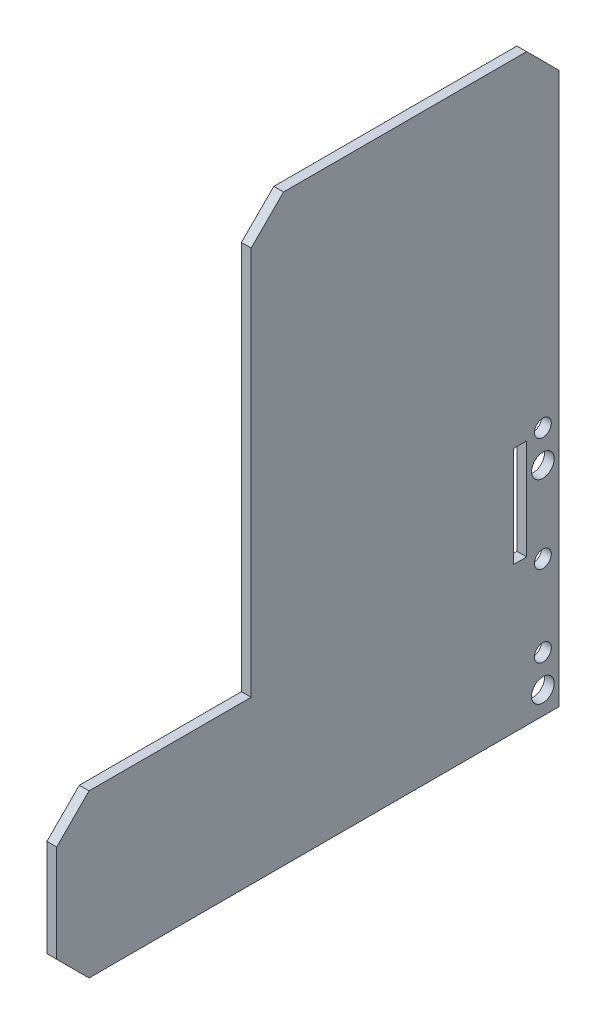
ISO-10303-21;
HEADER;
FILE_DESCRIPTION(('STEP AP214'),'2;1');
FILE_NAME('part.step','',(''),(''),'','','');
FILE_SCHEMA(('AUTOMOTIVE_DESIGN { 1 0 10303 214 1 1 1 1 }'));
ENDSEC;
DATA;
#1=APPLICATION_CONTEXT('core data for automotive mechanical design processes');
#2=APPLICATION_PROTOCOL_DEFINITION('international standard','automotive_design',2000,#1);
#3=PRODUCT_CONTEXT('',#1,'mechanical');
#4=PRODUCT('Part','Part','',(#3));
#5=PRODUCT_RELATED_PRODUCT_CATEGORY('part','',(#4));
#6=PRODUCT_DEFINITION_FORMATION('','',#4);
#7=PRODUCT_DEFINITION_CONTEXT('part definition',#1,'design');
#8=PRODUCT_DEFINITION('design','',#6,#7);
#9=PRODUCT_DEFINITION_SHAPE('','',#8);
#10=(LENGTH_UNIT() NAMED_UNIT(*) SI_UNIT(.MILLI.,.METRE.));
#11=(NAMED_UNIT(*) PLANE_ANGLE_UNIT() SI_UNIT($,.RADIAN.));
#12=(NAMED_UNIT(*) SI_UNIT($,.STERADIAN.) SOLID_ANGLE_UNIT());
#13=UNCERTAINTY_MEASURE_WITH_UNIT(LENGTH_MEASURE(1.E-05),#10,'distance_accuracy_value','');
#14=(GEOMETRIC_REPRESENTATION_CONTEXT(3) GLOBAL_UNCERTAINTY_ASSIGNED_CONTEXT((#13)) GLOBAL_UNIT_ASSIGNED_CONTEXT((#10,
#11,#12)) REPRESENTATION_CONTEXT('',''));
#15=CARTESIAN_POINT('',(0.,0.,0.));
#16=DIRECTION('',(0.,0.,1.));
#17=DIRECTION('',(1.,0.,0.));
#18=AXIS2_PLACEMENT_3D('',#15,#16,#17);
#19=CARTESIAN_POINT('',(1.5,-21.,-2.5));
#20=DIRECTION('',(-1.,0.,0.));
#21=DIRECTION('',(0.,0.,1.));
#22=AXIS2_PLACEMENT_3D('',#19,#20,#21);
#23=PLANE('',#22);
#24=DIRECTION('',(0.,0.,-1.));
#25=VECTOR('',#24,1.);
#26=CARTESIAN_POINT('',(1.5,17.,2.5));
#27=LINE('',#26,#25);
#28=CARTESIAN_POINT('',(1.5,17.,4.5));
#29=VERTEX_POINT('',#28);
#30=CARTESIAN_POINT('',(1.5,17.,2.5));
#31=VERTEX_POINT('',#30);
#32=EDGE_CURVE('E203',#29,#31,#27,.T.);
#33=ORIENTED_EDGE('',*,*,#32,.T.);
#34=DIRECTION('',(0.,-1.,0.));
#35=VECTOR('',#34,1.);
#36=CARTESIAN_POINT('',(1.5,17.,2.5));
#37=LINE('',#36,#35);
#38=CARTESIAN_POINT('',(1.5,1.5,2.5));
#39=VERTEX_POINT('',#38);
#40=EDGE_CURVE('E211',#31,#39,#37,.T.);
#41=ORIENTED_EDGE('',*,*,#40,.T.);
#42=DIRECTION('',(0.,0.,1.));
#43=VECTOR('',#42,1.);
#44=CARTESIAN_POINT('',(1.5,1.5,2.5));
#45=LINE('',#44,#43);
#46=CARTESIAN_POINT('',(1.5,1.5,4.5));
#47=VERTEX_POINT('',#46);
#48=EDGE_CURVE('E226',#39,#47,#45,.T.);
#49=ORIENTED_EDGE('',*,*,#48,.T.);
#50=DIRECTION('',(0.,1.,0.));
#51=VECTOR('',#50,1.);
#52=CARTESIAN_POINT('',(1.5,17.,4.5));
#53=LINE('',#52,#51);
#54=EDGE_CURVE('E223',#47,#29,#53,.T.);
#55=ORIENTED_EDGE('',*,*,#54,.T.);
#56=EDGE_LOOP('',(#33,#41,#49,#55));
#57=FACE_BOUND('',#56,.T.);
#58=CARTESIAN_POINT('',(1.5,17.5000000000024,0.));
#59=DIRECTION('',(1.,0.,0.));
#60=DIRECTION('',(0.,0.,-1.));
#61=AXIS2_PLACEMENT_3D('',#58,#59,#60);
#62=CIRCLE('',#61,1.29999994);
#63=CARTESIAN_POINT('',(1.5,17.5000000000024,-1.29999994));
#64=VERTEX_POINT('',#63);
#65=EDGE_CURVE('E195',#64,#64,#62,.T.);
#66=ORIENTED_EDGE('',*,*,#65,.F.);
#67=EDGE_LOOP('',(#66));
#68=FACE_BOUND('',#67,.T.);
#69=CARTESIAN_POINT('',(1.5,-12.4999999999975,0.));
#70=DIRECTION('',(1.,0.,0.));
#71=DIRECTION('',(0.,0.,-1.));
#72=AXIS2_PLACEMENT_3D('',#69,#70,#71);
#73=CIRCLE('',#72,1.29999994);
#74=CARTESIAN_POINT('',(1.5,-12.4999999999975,-1.29999994));
#75=VERTEX_POINT('',#74);
#76=EDGE_CURVE('E189',#75,#75,#73,.T.);
#77=ORIENTED_EDGE('',*,*,#76,.F.);
#78=EDGE_LOOP('',(#77));
#79=FACE_BOUND('',#78,.T.);
#80=CARTESIAN_POINT('',(1.5,0.,0.));
#81=DIRECTION('',(1.,0.,0.));
#82=DIRECTION('',(0.,0.,-1.));
#83=AXIS2_PLACEMENT_3D('',#80,#81,#82);
#84=CIRCLE('',#83,1.29999994);
#85=CARTESIAN_POINT('',(1.5,0.,-1.29999994));
#86=VERTEX_POINT('',#85);
#87=EDGE_CURVE('E183',#86,#86,#84,.T.);
#88=ORIENTED_EDGE('',*,*,#87,.F.);
#89=EDGE_LOOP('',(#88));
#90=FACE_BOUND('',#89,.T.);
#91=CARTESIAN_POINT('',(1.5,-17.4999999999984,1.66533453693773E-13));
#92=DIRECTION('',(1.,0.,0.));
#93=DIRECTION('',(0.,0.,-1.));
#94=AXIS2_PLACEMENT_3D('',#91,#92,#93);
#95=CIRCLE('',#94,1.75);
#96=CARTESIAN_POINT('',(1.5,-17.4999999999984,-1.74999999999984));
#97=VERTEX_POINT('',#96);
#98=EDGE_CURVE('E161',#97,#97,#95,.T.);
#99=ORIENTED_EDGE('',*,*,#98,.F.);
#100=EDGE_LOOP('',(#99));
#101=FACE_BOUND('',#100,.T.);
#102=DIRECTION('',(0.,-1.,0.));
#103=VECTOR('',#102,1.);
#104=CARTESIAN_POINT('',(1.5,69.,75.));
#105=LINE('',#104,#103);
#106=CARTESIAN_POINT('',(1.5,-1.00000000000001,75.));
#107=VERTEX_POINT('',#106);
#108=CARTESIAN_POINT('',(1.5,-16.,75.));
#109=VERTEX_POINT('',#108);
#110=EDGE_CURVE('E163',#107,#109,#105,.T.);
#111=ORIENTED_EDGE('',*,*,#110,.T.);
#112=DIRECTION('',(0.,0.707106781186545,0.70710678118655));
#113=VECTOR('',#112,1.);
#114=CARTESIAN_POINT('',(1.5,-21.,70.));
#115=LINE('',#114,#113);
#116=CARTESIAN_POINT('',(1.5,-21.,70.));
#117=VERTEX_POINT('',#116);
#118=EDGE_CURVE('E132',#117,#109,#115,.T.);
#119=ORIENTED_EDGE('',*,*,#118,.F.);
#120=DIRECTION('',(0.,0.,-1.));
#121=VECTOR('',#120,1.);
#122=CARTESIAN_POINT('',(1.5,-21.,-2.5));
#123=LINE('',#122,#121);
#124=CARTESIAN_POINT('',(1.5,-21.,-2.5));
#125=VERTEX_POINT('',#124);
#126=EDGE_CURVE('E38',#117,#125,#123,.T.);
#127=ORIENTED_EDGE('',*,*,#126,.T.);
#128=DIRECTION('',(0.,1.,0.));
#129=VECTOR('',#128,1.);
#130=CARTESIAN_POINT('',(1.5,69.,-2.49999999999999));
#131=LINE('',#130,#129);
#132=CARTESIAN_POINT('',(1.5,64.,-2.49999999999999));
#133=VERTEX_POINT('',#132);
#134=EDGE_CURVE('E155',#125,#133,#131,.T.);
#135=ORIENTED_EDGE('',*,*,#134,.T.);
#136=DIRECTION('',(0.,-0.707106781186548,-0.707106781186547));
#137=VECTOR('',#136,1.);
#138=CARTESIAN_POINT('',(1.5,64.,-2.49999999999999));
#139=LINE('',#138,#137);
#140=CARTESIAN_POINT('',(1.5,69.,2.50000000000001));
#141=VERTEX_POINT('',#140);
#142=EDGE_CURVE('E137',#141,#133,#139,.T.);
#143=ORIENTED_EDGE('',*,*,#142,.F.);
#144=DIRECTION('',(0.,0.,1.));
#145=VECTOR('',#144,1.);
#146=CARTESIAN_POINT('',(1.5,69.,-2.49999999999999));
#147=LINE('',#146,#145);
#148=CARTESIAN_POINT('',(1.5,69.,40.));
#149=VERTEX_POINT('',#148);
#150=EDGE_CURVE('E165',#141,#149,#147,.T.);
#151=ORIENTED_EDGE('',*,*,#150,.T.);
#152=DIRECTION('',(0.,0.707106781186544,-0.707106781186551));
#153=VECTOR('',#152,1.);
#154=CARTESIAN_POINT('',(1.5,64.,45.));
#155=LINE('',#154,#153);
#156=CARTESIAN_POINT('',(1.5,64.,45.));
#157=VERTEX_POINT('',#156);
#158=EDGE_CURVE('E233',#157,#149,#155,.T.);
#159=ORIENTED_EDGE('',*,*,#158,.F.);
#160=DIRECTION('',(0.,1.,0.));
#161=VECTOR('',#160,1.);
#162=CARTESIAN_POINT('',(1.5,3.99999999999999,45.));
#163=LINE('',#162,#161);
#164=CARTESIAN_POINT('',(1.5,3.99999999999999,45.));
#165=VERTEX_POINT('',#164);
#166=EDGE_CURVE('E243',#165,#157,#163,.T.);
#167=ORIENTED_EDGE('',*,*,#166,.F.);
#168=DIRECTION('',(0.,0.,-1.));
#169=VECTOR('',#168,1.);
#170=CARTESIAN_POINT('',(1.5,3.99999999999999,70.));
#171=LINE('',#170,#169);
#172=CARTESIAN_POINT('',(1.5,3.99999999999999,70.));
#173=VERTEX_POINT('',#172);
#174=EDGE_CURVE('E246',#173,#165,#171,.T.);
#175=ORIENTED_EDGE('',*,*,#174,.F.);
#176=DIRECTION('',(0.,0.707106781186547,-0.707106781186548));
#177=VECTOR('',#176,1.);
#178=CARTESIAN_POINT('',(1.5,3.99999999999999,70.));
#179=LINE('',#178,#177);
#180=EDGE_CURVE('E249',#107,#173,#179,.T.);
#181=ORIENTED_EDGE('',*,*,#180,.F.);
#182=EDGE_LOOP('',(#111,#119,#127,#135,#143,#151,#159,#167,#175,#181));
#183=FACE_BOUND('',#182,.T.);
#184=CARTESIAN_POINT('',(1.5,12.5000000000017,0.));
#185=DIRECTION('',(1.,0.,0.));
#186=DIRECTION('',(0.,0.,-1.));
#187=AXIS2_PLACEMENT_3D('',#184,#185,#186);
#188=CIRCLE('',#187,1.75);
#189=CARTESIAN_POINT('',(1.5,12.5000000000017,-1.75000000000006));
#190=VERTEX_POINT('',#189);
#191=EDGE_CURVE('E172',#190,#190,#188,.T.);
#192=ORIENTED_EDGE('',*,*,#191,.F.);
#193=EDGE_LOOP('',(#192));
#194=FACE_BOUND('',#193,.T.);
#195=ADVANCED_FACE('F30',(#57,#68,#79,#90,#101,#183,#194),#23,.F.);
#196=CARTESIAN_POINT('',(0.,-21.,-2.5));
#197=DIRECTION('',(-1.,0.,0.));
#198=DIRECTION('',(0.,0.,1.));
#199=AXIS2_PLACEMENT_3D('',#196,#197,#198);
#200=PLANE('',#199);
#201=DIRECTION('',(0.,0.707106781186545,0.70710678118655));
#202=VECTOR('',#201,1.);
#203=CARTESIAN_POINT('',(0.,-21.,70.));
#204=LINE('',#203,#202);
#205=CARTESIAN_POINT('',(0.,-21.,70.));
#206=VERTEX_POINT('',#205);
#207=CARTESIAN_POINT('',(0.,-16.,75.));
#208=VERTEX_POINT('',#207);
#209=EDGE_CURVE('E45',#206,#208,#204,.T.);
#210=ORIENTED_EDGE('',*,*,#209,.T.);
#211=DIRECTION('',(0.,-1.,0.));
#212=VECTOR('',#211,1.);
#213=CARTESIAN_POINT('',(0.,69.,75.));
#214=LINE('',#213,#212);
#215=CARTESIAN_POINT('',(0.,-0.999999999999959,75.));
#216=VERTEX_POINT('',#215);
#217=EDGE_CURVE('E146',#216,#208,#214,.T.);
#218=ORIENTED_EDGE('',*,*,#217,.F.);
#219=DIRECTION('',(0.,0.707106781186547,-0.707106781186548));
#220=VECTOR('',#219,1.);
#221=CARTESIAN_POINT('',(0.,3.99999999999999,70.));
#222=LINE('',#221,#220);
#223=CARTESIAN_POINT('',(0.,3.99999999999999,70.));
#224=VERTEX_POINT('',#223);
#225=EDGE_CURVE('E261',#216,#224,#222,.T.);
#226=ORIENTED_EDGE('',*,*,#225,.T.);
#227=DIRECTION('',(0.,0.,-1.));
#228=VECTOR('',#227,1.);
#229=CARTESIAN_POINT('',(0.,3.99999999999999,70.));
#230=LINE('',#229,#228);
#231=CARTESIAN_POINT('',(0.,3.99999999999999,45.));
#232=VERTEX_POINT('',#231);
#233=EDGE_CURVE('E258',#224,#232,#230,.T.);
#234=ORIENTED_EDGE('',*,*,#233,.T.);
#235=DIRECTION('',(0.,1.,0.));
#236=VECTOR('',#235,1.);
#237=CARTESIAN_POINT('',(0.,3.99999999999999,45.));
#238=LINE('',#237,#236);
#239=CARTESIAN_POINT('',(0.,64.,45.));
#240=VERTEX_POINT('',#239);
#241=EDGE_CURVE('E255',#232,#240,#238,.T.);
#242=ORIENTED_EDGE('',*,*,#241,.T.);
#243=DIRECTION('',(0.,0.707106781186544,-0.707106781186551));
#244=VECTOR('',#243,1.);
#245=CARTESIAN_POINT('',(0.,64.,45.));
#246=LINE('',#245,#244);
#247=CARTESIAN_POINT('',(0.,69.,40.));
#248=VERTEX_POINT('',#247);
#249=EDGE_CURVE('E252',#240,#248,#246,.T.);
#250=ORIENTED_EDGE('',*,*,#249,.T.);
#251=DIRECTION('',(0.,0.,1.));
#252=VECTOR('',#251,1.);
#253=CARTESIAN_POINT('',(0.,69.,-2.49999999999999));
#254=LINE('',#253,#252);
#255=CARTESIAN_POINT('',(0.,69.,2.50000000000001));
#256=VERTEX_POINT('',#255);
#257=EDGE_CURVE('E153',#256,#248,#254,.T.);
#258=ORIENTED_EDGE('',*,*,#257,.F.);
#259=DIRECTION('',(0.,-0.707106781186548,-0.707106781186547));
#260=VECTOR('',#259,1.);
#261=CARTESIAN_POINT('',(0.,64.,-2.49999999999999));
#262=LINE('',#261,#260);
#263=CARTESIAN_POINT('',(0.,64.,-2.49999999999999));
#264=VERTEX_POINT('',#263);
#265=EDGE_CURVE('E53',#256,#264,#262,.T.);
#266=ORIENTED_EDGE('',*,*,#265,.T.);
#267=DIRECTION('',(0.,1.,0.));
#268=VECTOR('',#267,1.);
#269=CARTESIAN_POINT('',(0.,69.,-2.49999999999999));
#270=LINE('',#269,#268);
#271=CARTESIAN_POINT('',(0.,-21.,-2.5));
#272=VERTEX_POINT('',#271);
#273=EDGE_CURVE('E156',#272,#264,#270,.T.);
#274=ORIENTED_EDGE('',*,*,#273,.F.);
#275=DIRECTION('',(0.,0.,-1.));
#276=VECTOR('',#275,1.);
#277=CARTESIAN_POINT('',(0.,-21.,-2.5));
#278=LINE('',#277,#276);
#279=EDGE_CURVE('E148',#206,#272,#278,.T.);
#280=ORIENTED_EDGE('',*,*,#279,.F.);
#281=EDGE_LOOP('',(#210,#218,#226,#234,#242,#250,#258,#266,#274,#280));
#282=FACE_BOUND('',#281,.T.);
#283=DIRECTION('',(0.,-1.,0.));
#284=VECTOR('',#283,1.);
#285=CARTESIAN_POINT('',(0.,17.,2.5));
#286=LINE('',#285,#284);
#287=CARTESIAN_POINT('',(0.,17.,2.5));
#288=VERTEX_POINT('',#287);
#289=CARTESIAN_POINT('',(0.,1.5,2.5));
#290=VERTEX_POINT('',#289);
#291=EDGE_CURVE('E218',#288,#290,#286,.T.);
#292=ORIENTED_EDGE('',*,*,#291,.F.);
#293=DIRECTION('',(0.,0.,-1.));
#294=VECTOR('',#293,1.);
#295=CARTESIAN_POINT('',(0.,17.,2.5));
#296=LINE('',#295,#294);
#297=CARTESIAN_POINT('',(0.,17.,4.5));
#298=VERTEX_POINT('',#297);
#299=EDGE_CURVE('E208',#298,#288,#296,.T.);
#300=ORIENTED_EDGE('',*,*,#299,.F.);
#301=DIRECTION('',(0.,1.,0.));
#302=VECTOR('',#301,1.);
#303=CARTESIAN_POINT('',(0.,17.,4.5));
#304=LINE('',#303,#302);
#305=CARTESIAN_POINT('',(0.,1.5,4.5));
#306=VERTEX_POINT('',#305);
#307=EDGE_CURVE('E212',#306,#298,#304,.T.);
#308=ORIENTED_EDGE('',*,*,#307,.F.);
#309=DIRECTION('',(0.,0.,1.));
#310=VECTOR('',#309,1.);
#311=CARTESIAN_POINT('',(0.,1.5,2.5));
#312=LINE('',#311,#310);
#313=EDGE_CURVE('E215',#290,#306,#312,.T.);
#314=ORIENTED_EDGE('',*,*,#313,.F.);
#315=EDGE_LOOP('',(#292,#300,#308,#314));
#316=FACE_BOUND('',#315,.T.);
#317=CARTESIAN_POINT('',(0.,17.5000000000024,0.));
#318=DIRECTION('',(1.,0.,0.));
#319=DIRECTION('',(0.,0.,-1.));
#320=AXIS2_PLACEMENT_3D('',#317,#318,#319);
#321=CIRCLE('',#320,1.29999994);
#322=CARTESIAN_POINT('',(0.,17.5000000000024,-1.29999994));
#323=VERTEX_POINT('',#322);
#324=EDGE_CURVE('E192',#323,#323,#321,.T.);
#325=ORIENTED_EDGE('',*,*,#324,.T.);
#326=EDGE_LOOP('',(#325));
#327=FACE_BOUND('',#326,.T.);
#328=CARTESIAN_POINT('',(0.,-12.4999999999975,0.));
#329=DIRECTION('',(1.,0.,0.));
#330=DIRECTION('',(0.,0.,-1.));
#331=AXIS2_PLACEMENT_3D('',#328,#329,#330);
#332=CIRCLE('',#331,1.29999994);
#333=CARTESIAN_POINT('',(0.,-12.4999999999975,-1.29999994));
#334=VERTEX_POINT('',#333);
#335=EDGE_CURVE('E186',#334,#334,#332,.T.);
#336=ORIENTED_EDGE('',*,*,#335,.T.);
#337=EDGE_LOOP('',(#336));
#338=FACE_BOUND('',#337,.T.);
#339=CARTESIAN_POINT('',(0.,0.,0.));
#340=DIRECTION('',(1.,0.,0.));
#341=DIRECTION('',(0.,0.,-1.));
#342=AXIS2_PLACEMENT_3D('',#339,#340,#341);
#343=CIRCLE('',#342,1.29999994);
#344=CARTESIAN_POINT('',(0.,0.,-1.29999994));
#345=VERTEX_POINT('',#344);
#346=EDGE_CURVE('E178',#345,#345,#343,.T.);
#347=ORIENTED_EDGE('',*,*,#346,.T.);
#348=EDGE_LOOP('',(#347));
#349=FACE_BOUND('',#348,.T.);
#350=CARTESIAN_POINT('',(0.,-17.4999999999984,1.66533453693773E-13));
#351=DIRECTION('',(1.,0.,0.));
#352=DIRECTION('',(0.,0.,-1.));
#353=AXIS2_PLACEMENT_3D('',#350,#351,#352);
#354=CIRCLE('',#353,1.75);
#355=CARTESIAN_POINT('',(0.,-17.4999999999984,-1.74999999999984));
#356=VERTEX_POINT('',#355);
#357=EDGE_CURVE('E169',#356,#356,#354,.T.);
#358=ORIENTED_EDGE('',*,*,#357,.T.);
#359=EDGE_LOOP('',(#358));
#360=FACE_BOUND('',#359,.T.);
#361=CARTESIAN_POINT('',(0.,12.5000000000017,0.));
#362=DIRECTION('',(1.,0.,0.));
#363=DIRECTION('',(0.,0.,-1.));
#364=AXIS2_PLACEMENT_3D('',#361,#362,#363);
#365=CIRCLE('',#364,1.75);
#366=CARTESIAN_POINT('',(0.,12.5000000000017,-1.75000000000006));
#367=VERTEX_POINT('',#366);
#368=EDGE_CURVE('E175',#367,#367,#365,.T.);
#369=ORIENTED_EDGE('',*,*,#368,.T.);
#370=EDGE_LOOP('',(#369));
#371=FACE_BOUND('',#370,.T.);
#372=ADVANCED_FACE('F143',(#282,#316,#327,#338,#349,#360,#371),#200,.T.);
#373=CARTESIAN_POINT('',(1.5,69.,-2.49999999999999));
#374=DIRECTION('',(0.,0.,1.));
#375=DIRECTION('',(0.,-1.,0.));
#376=AXIS2_PLACEMENT_3D('',#373,#374,#375);
#377=PLANE('',#376);
#378=ORIENTED_EDGE('',*,*,#273,.T.);
#379=DIRECTION('',(1.,0.,0.));
#380=VECTOR('',#379,1.);
#381=CARTESIAN_POINT('',(-0.000999999999999916,64.,-2.49999999999999));
#382=LINE('',#381,#380);
#383=EDGE_CURVE('E264',#264,#133,#382,.T.);
#384=ORIENTED_EDGE('',*,*,#383,.T.);
#385=ORIENTED_EDGE('',*,*,#134,.F.);
#386=DIRECTION('',(-1.,0.,0.));
#387=VECTOR('',#386,1.);
#388=CARTESIAN_POINT('',(1.5,-21.,-2.5));
#389=LINE('',#388,#387);
#390=EDGE_CURVE('E11',#125,#272,#389,.T.);
#391=ORIENTED_EDGE('',*,*,#390,.T.);
#392=EDGE_LOOP('',(#378,#384,#385,#391));
#393=FACE_BOUND('',#392,.T.);
#394=ADVANCED_FACE('F32',(#393),#377,.F.);
#395=CARTESIAN_POINT('',(1.5,69.,-2.49999999999999));
#396=DIRECTION('',(0.,-1.,0.));
#397=DIRECTION('',(0.,0.,-1.));
#398=AXIS2_PLACEMENT_3D('',#395,#396,#397);
#399=PLANE('',#398);
#400=ORIENTED_EDGE('',*,*,#150,.F.);
#401=DIRECTION('',(1.,0.,0.));
#402=VECTOR('',#401,1.);
#403=CARTESIAN_POINT('',(-0.000999999999999916,69.,2.50000000000001));
#404=LINE('',#403,#402);
#405=EDGE_CURVE('E265',#256,#141,#404,.T.);
#406=ORIENTED_EDGE('',*,*,#405,.F.);
#407=ORIENTED_EDGE('',*,*,#257,.T.);
#408=DIRECTION('',(1.,0.,0.));
#409=VECTOR('',#408,1.);
#410=CARTESIAN_POINT('',(-0.000999999999999916,69.,40.));
#411=LINE('',#410,#409);
#412=EDGE_CURVE('E220',#248,#149,#411,.T.);
#413=ORIENTED_EDGE('',*,*,#412,.T.);
#414=EDGE_LOOP('',(#400,#406,#407,#413));
#415=FACE_BOUND('',#414,.T.);
#416=ADVANCED_FACE('F284',(#415),#399,.F.);
#417=CARTESIAN_POINT('',(1.5,69.,75.));
#418=DIRECTION('',(0.,0.,-1.));
#419=DIRECTION('',(-1.,0.,0.));
#420=AXIS2_PLACEMENT_3D('',#417,#418,#419);
#421=PLANE('',#420);
#422=ORIENTED_EDGE('',*,*,#217,.T.);
#423=DIRECTION('',(1.,0.,0.));
#424=VECTOR('',#423,1.);
#425=CARTESIAN_POINT('',(-0.000999999999999916,-16.,75.));
#426=LINE('',#425,#424);
#427=EDGE_CURVE('E129',#208,#109,#426,.T.);
#428=ORIENTED_EDGE('',*,*,#427,.T.);
#429=ORIENTED_EDGE('',*,*,#110,.F.);
#430=DIRECTION('',(1.,0.,0.));
#431=VECTOR('',#430,1.);
#432=CARTESIAN_POINT('',(-0.000999999999999916,-1.00000000000001,75.));
#433=LINE('',#432,#431);
#434=EDGE_CURVE('E152',#216,#107,#433,.T.);
#435=ORIENTED_EDGE('',*,*,#434,.F.);
#436=EDGE_LOOP('',(#422,#428,#429,#435));
#437=FACE_BOUND('',#436,.T.);
#438=ADVANCED_FACE('F151',(#437),#421,.F.);
#439=CARTESIAN_POINT('',(1.5,-21.,-2.5));
#440=DIRECTION('',(0.,1.,0.));
#441=DIRECTION('',(0.,0.,1.));
#442=AXIS2_PLACEMENT_3D('',#439,#440,#441);
#443=PLANE('',#442);
#444=ORIENTED_EDGE('',*,*,#126,.F.);
#445=DIRECTION('',(1.,0.,0.));
#446=VECTOR('',#445,1.);
#447=CARTESIAN_POINT('',(-0.000999999999999916,-21.,70.));
#448=LINE('',#447,#446);
#449=EDGE_CURVE('E138',#206,#117,#448,.T.);
#450=ORIENTED_EDGE('',*,*,#449,.F.);
#451=ORIENTED_EDGE('',*,*,#279,.T.);
#452=ORIENTED_EDGE('',*,*,#390,.F.);
#453=EDGE_LOOP('',(#444,#450,#451,#452));
#454=FACE_BOUND('',#453,.T.);
#455=ADVANCED_FACE('F277',(#454),#443,.F.);
#456=CARTESIAN_POINT('',(1.5,-17.4999999999984,1.66533453693773E-13));
#457=DIRECTION('',(-1.,0.,0.));
#458=DIRECTION('',(0.,0.,1.));
#459=AXIS2_PLACEMENT_3D('',#456,#457,#458);
#460=CYLINDRICAL_SURFACE('',#459,1.75);
#461=ORIENTED_EDGE('',*,*,#98,.T.);
#462=EDGE_LOOP('',(#461));
#463=FACE_BOUND('',#462,.T.);
#464=ORIENTED_EDGE('',*,*,#357,.F.);
#465=EDGE_LOOP('',(#464));
#466=FACE_BOUND('',#465,.T.);
#467=ADVANCED_FACE('F319',(#463,#466),#460,.F.);
#468=CARTESIAN_POINT('',(1.5,12.5000000000017,0.));
#469=DIRECTION('',(-1.,0.,0.));
#470=DIRECTION('',(0.,0.,1.));
#471=AXIS2_PLACEMENT_3D('',#468,#469,#470);
#472=CYLINDRICAL_SURFACE('',#471,1.75);
#473=ORIENTED_EDGE('',*,*,#191,.T.);
#474=EDGE_LOOP('',(#473));
#475=FACE_BOUND('',#474,.T.);
#476=ORIENTED_EDGE('',*,*,#368,.F.);
#477=EDGE_LOOP('',(#476));
#478=FACE_BOUND('',#477,.T.);
#479=ADVANCED_FACE('F410',(#475,#478),#472,.F.);
#480=CARTESIAN_POINT('',(1.5,0.,0.));
#481=DIRECTION('',(1.,0.,0.));
#482=DIRECTION('',(0.,0.,-1.));
#483=AXIS2_PLACEMENT_3D('',#480,#481,#482);
#484=CYLINDRICAL_SURFACE('',#483,1.29999994);
#485=ORIENTED_EDGE('',*,*,#346,.F.);
#486=EDGE_LOOP('',(#485));
#487=FACE_BOUND('',#486,.T.);
#488=ORIENTED_EDGE('',*,*,#87,.T.);
#489=EDGE_LOOP('',(#488));
#490=FACE_BOUND('',#489,.T.);
#491=ADVANCED_FACE('F400',(#487,#490),#484,.F.);
#492=CARTESIAN_POINT('',(1.5,-12.4999999999975,0.));
#493=DIRECTION('',(1.,0.,0.));
#494=DIRECTION('',(0.,0.,-1.));
#495=AXIS2_PLACEMENT_3D('',#492,#493,#494);
#496=CYLINDRICAL_SURFACE('',#495,1.29999994);
#497=ORIENTED_EDGE('',*,*,#335,.F.);
#498=EDGE_LOOP('',(#497));
#499=FACE_BOUND('',#498,.T.);
#500=ORIENTED_EDGE('',*,*,#76,.T.);
#501=EDGE_LOOP('',(#500));
#502=FACE_BOUND('',#501,.T.);
#503=ADVANCED_FACE('F390',(#499,#502),#496,.F.);
#504=CARTESIAN_POINT('',(1.5,17.5000000000024,0.));
#505=DIRECTION('',(1.,0.,0.));
#506=DIRECTION('',(0.,0.,-1.));
#507=AXIS2_PLACEMENT_3D('',#504,#505,#506);
#508=CYLINDRICAL_SURFACE('',#507,1.29999994);
#509=ORIENTED_EDGE('',*,*,#324,.F.);
#510=EDGE_LOOP('',(#509));
#511=FACE_BOUND('',#510,.T.);
#512=ORIENTED_EDGE('',*,*,#65,.T.);
#513=EDGE_LOOP('',(#512));
#514=FACE_BOUND('',#513,.T.);
#515=ADVANCED_FACE('F380',(#511,#514),#508,.F.);
#516=CARTESIAN_POINT('',(1.5,17.,2.5));
#517=DIRECTION('',(0.,0.,-1.));
#518=DIRECTION('',(-1.,0.,0.));
#519=AXIS2_PLACEMENT_3D('',#516,#517,#518);
#520=PLANE('',#519);
#521=ORIENTED_EDGE('',*,*,#291,.T.);
#522=DIRECTION('',(-1.,0.,0.));
#523=VECTOR('',#522,1.);
#524=CARTESIAN_POINT('',(1.5,1.5,2.5));
#525=LINE('',#524,#523);
#526=EDGE_CURVE('E199',#39,#290,#525,.T.);
#527=ORIENTED_EDGE('',*,*,#526,.F.);
#528=ORIENTED_EDGE('',*,*,#40,.F.);
#529=DIRECTION('',(-1.,0.,0.));
#530=VECTOR('',#529,1.);
#531=CARTESIAN_POINT('',(1.5,17.,2.5));
#532=LINE('',#531,#530);
#533=EDGE_CURVE('E198',#31,#288,#532,.T.);
#534=ORIENTED_EDGE('',*,*,#533,.T.);
#535=EDGE_LOOP('',(#521,#527,#528,#534));
#536=FACE_BOUND('',#535,.T.);
#537=ADVANCED_FACE('F371',(#536),#520,.F.);
#538=CARTESIAN_POINT('',(1.5,17.,2.5));
#539=DIRECTION('',(0.,1.,0.));
#540=DIRECTION('',(0.,0.,1.));
#541=AXIS2_PLACEMENT_3D('',#538,#539,#540);
#542=PLANE('',#541);
#543=ORIENTED_EDGE('',*,*,#299,.T.);
#544=ORIENTED_EDGE('',*,*,#533,.F.);
#545=ORIENTED_EDGE('',*,*,#32,.F.);
#546=DIRECTION('',(-1.,0.,0.));
#547=VECTOR('',#546,1.);
#548=CARTESIAN_POINT('',(1.5,17.,4.5));
#549=LINE('',#548,#547);
#550=EDGE_CURVE('E205',#29,#298,#549,.T.);
#551=ORIENTED_EDGE('',*,*,#550,.T.);
#552=EDGE_LOOP('',(#543,#544,#545,#551));
#553=FACE_BOUND('',#552,.T.);
#554=ADVANCED_FACE('F361',(#553),#542,.F.);
#555=CARTESIAN_POINT('',(1.5,17.,4.5));
#556=DIRECTION('',(0.,0.,1.));
#557=DIRECTION('',(1.,0.,0.));
#558=AXIS2_PLACEMENT_3D('',#555,#556,#557);
#559=PLANE('',#558);
#560=ORIENTED_EDGE('',*,*,#307,.T.);
#561=ORIENTED_EDGE('',*,*,#550,.F.);
#562=ORIENTED_EDGE('',*,*,#54,.F.);
#563=DIRECTION('',(-1.,0.,0.));
#564=VECTOR('',#563,1.);
#565=CARTESIAN_POINT('',(1.5,1.5,4.5));
#566=LINE('',#565,#564);
#567=EDGE_CURVE('E202',#47,#306,#566,.T.);
#568=ORIENTED_EDGE('',*,*,#567,.T.);
#569=EDGE_LOOP('',(#560,#561,#562,#568));
#570=FACE_BOUND('',#569,.T.);
#571=ADVANCED_FACE('F349',(#570),#559,.F.);
#572=CARTESIAN_POINT('',(1.5,1.5,2.5));
#573=DIRECTION('',(0.,-1.,0.));
#574=DIRECTION('',(0.,0.,-1.));
#575=AXIS2_PLACEMENT_3D('',#572,#573,#574);
#576=PLANE('',#575);
#577=ORIENTED_EDGE('',*,*,#313,.T.);
#578=ORIENTED_EDGE('',*,*,#567,.F.);
#579=ORIENTED_EDGE('',*,*,#48,.F.);
#580=ORIENTED_EDGE('',*,*,#526,.T.);
#581=EDGE_LOOP('',(#577,#578,#579,#580));
#582=FACE_BOUND('',#581,.T.);
#583=ADVANCED_FACE('F344',(#582),#576,.F.);
#584=CARTESIAN_POINT('',(-0.000999999999999916,64.,45.));
#585=DIRECTION('',(0.,-0.707106781186551,-0.707106781186544));
#586=DIRECTION('',(0.,0.707106781186544,-0.707106781186551));
#587=AXIS2_PLACEMENT_3D('',#584,#585,#586);
#588=PLANE('',#587);
#589=DIRECTION('',(1.,0.,0.));
#590=VECTOR('',#589,1.);
#591=CARTESIAN_POINT('',(-0.000999999999999916,64.,45.));
#592=LINE('',#591,#590);
#593=EDGE_CURVE('E237',#240,#157,#592,.T.);
#594=ORIENTED_EDGE('',*,*,#593,.T.);
#595=ORIENTED_EDGE('',*,*,#158,.T.);
#596=ORIENTED_EDGE('',*,*,#412,.F.);
#597=ORIENTED_EDGE('',*,*,#249,.F.);
#598=EDGE_LOOP('',(#594,#595,#596,#597));
#599=FACE_BOUND('',#598,.T.);
#600=ADVANCED_FACE('F288',(#599),#588,.F.);
#601=CARTESIAN_POINT('',(-0.000999999999999916,3.99999999999999,45.));
#602=DIRECTION('',(0.,0.,-1.));
#603=DIRECTION('',(-1.,0.,0.));
#604=AXIS2_PLACEMENT_3D('',#601,#602,#603);
#605=PLANE('',#604);
#606=DIRECTION('',(1.,0.,0.));
#607=VECTOR('',#606,1.);
#608=CARTESIAN_POINT('',(-0.000999999999999916,3.99999999999999,45.));
#609=LINE('',#608,#607);
#610=EDGE_CURVE('E235',#232,#165,#609,.T.);
#611=ORIENTED_EDGE('',*,*,#610,.T.);
#612=ORIENTED_EDGE('',*,*,#166,.T.);
#613=ORIENTED_EDGE('',*,*,#593,.F.);
#614=ORIENTED_EDGE('',*,*,#241,.F.);
#615=EDGE_LOOP('',(#611,#612,#613,#614));
#616=FACE_BOUND('',#615,.T.);
#617=ADVANCED_FACE('F292',(#616),#605,.F.);
#618=CARTESIAN_POINT('',(-0.000999999999999916,3.99999999999999,70.));
#619=DIRECTION('',(0.,-1.,0.));
#620=DIRECTION('',(0.,0.,-1.));
#621=AXIS2_PLACEMENT_3D('',#618,#619,#620);
#622=PLANE('',#621);
#623=DIRECTION('',(1.,0.,0.));
#624=VECTOR('',#623,1.);
#625=CARTESIAN_POINT('',(-0.000999999999999916,3.99999999999999,70.));
#626=LINE('',#625,#624);
#627=EDGE_CURVE('E232',#224,#173,#626,.T.);
#628=ORIENTED_EDGE('',*,*,#627,.T.);
#629=ORIENTED_EDGE('',*,*,#174,.T.);
#630=ORIENTED_EDGE('',*,*,#610,.F.);
#631=ORIENTED_EDGE('',*,*,#233,.F.);
#632=EDGE_LOOP('',(#628,#629,#630,#631));
#633=FACE_BOUND('',#632,.T.);
#634=ADVANCED_FACE('F294',(#633),#622,.F.);
#635=CARTESIAN_POINT('',(-0.000999999999999916,3.99999999999999,70.));
#636=DIRECTION('',(0.,-0.707106781186548,-0.707106781186547));
#637=DIRECTION('',(0.,0.707106781186547,-0.707106781186548));
#638=AXIS2_PLACEMENT_3D('',#635,#636,#637);
#639=PLANE('',#638);
#640=ORIENTED_EDGE('',*,*,#434,.T.);
#641=ORIENTED_EDGE('',*,*,#180,.T.);
#642=ORIENTED_EDGE('',*,*,#627,.F.);
#643=ORIENTED_EDGE('',*,*,#225,.F.);
#644=EDGE_LOOP('',(#640,#641,#642,#643));
#645=FACE_BOUND('',#644,.T.);
#646=ADVANCED_FACE('F299',(#645),#639,.F.);
#647=CARTESIAN_POINT('',(-0.000999999999999916,64.,-2.49999999999999));
#648=DIRECTION('',(0.,-0.707106781186547,0.707106781186548));
#649=DIRECTION('',(0.,-0.707106781186548,-0.707106781186547));
#650=AXIS2_PLACEMENT_3D('',#647,#648,#649);
#651=PLANE('',#650);
#652=ORIENTED_EDGE('',*,*,#405,.T.);
#653=ORIENTED_EDGE('',*,*,#142,.T.);
#654=ORIENTED_EDGE('',*,*,#383,.F.);
#655=ORIENTED_EDGE('',*,*,#265,.F.);
#656=EDGE_LOOP('',(#652,#653,#654,#655));
#657=FACE_BOUND('',#656,.T.);
#658=ADVANCED_FACE('F301',(#657),#651,.F.);
#659=CARTESIAN_POINT('',(-0.000999999999999916,-21.,70.));
#660=DIRECTION('',(0.,0.70710678118655,-0.707106781186545));
#661=DIRECTION('',(0.,0.707106781186545,0.70710678118655));
#662=AXIS2_PLACEMENT_3D('',#659,#660,#661);
#663=PLANE('',#662);
#664=ORIENTED_EDGE('',*,*,#449,.T.);
#665=ORIENTED_EDGE('',*,*,#118,.T.);
#666=ORIENTED_EDGE('',*,*,#427,.F.);
#667=ORIENTED_EDGE('',*,*,#209,.F.);
#668=EDGE_LOOP('',(#664,#665,#666,#667));
#669=FACE_BOUND('',#668,.T.);
#670=ADVANCED_FACE('F130',(#669),#663,.F.);
#671=CLOSED_SHELL('',(#195,#372,#394,#416,#438,#455,#467,#479,#491,#503,#515,#537,#554,#571,
#583,#600,#617,#634,#646,#658,#670));
#672=MANIFOLD_SOLID_BREP('B2',#671);
#673=ADVANCED_BREP_SHAPE_REPRESENTATION('',(#18,#672),#14);
#674=SHAPE_DEFINITION_REPRESENTATION(#9,#673);
ENDSEC;
END-ISO-10303-21;
